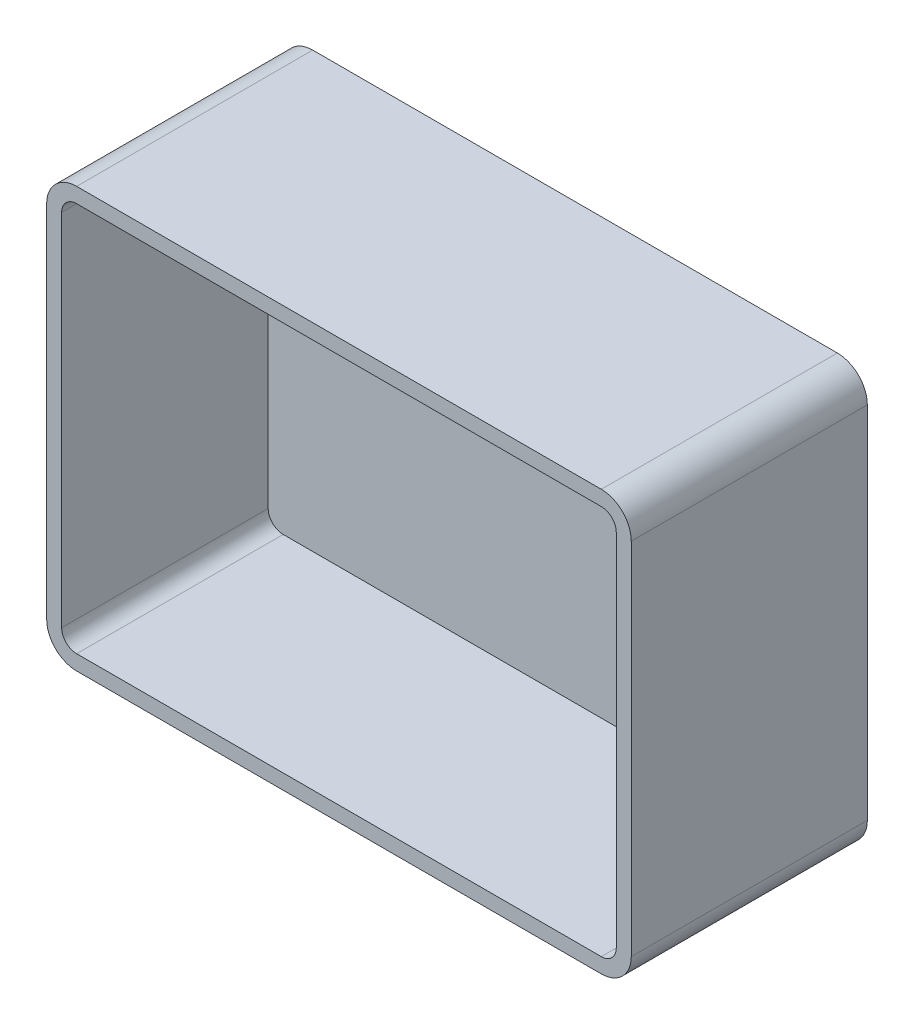
ISO-10303-21;
HEADER;
FILE_DESCRIPTION(('STEP AP214'),'2;1');
FILE_NAME('part.step','',(''),(''),'','','');
FILE_SCHEMA(('AUTOMOTIVE_DESIGN { 1 0 10303 214 1 1 1 1 }'));
ENDSEC;
DATA;
#1=APPLICATION_CONTEXT('core data for automotive mechanical design processes');
#2=APPLICATION_PROTOCOL_DEFINITION('international standard','automotive_design',2000,#1);
#3=PRODUCT_CONTEXT('',#1,'mechanical');
#4=PRODUCT('Part','Part','',(#3));
#5=PRODUCT_RELATED_PRODUCT_CATEGORY('part','',(#4));
#6=PRODUCT_DEFINITION_FORMATION('','',#4);
#7=PRODUCT_DEFINITION_CONTEXT('part definition',#1,'design');
#8=PRODUCT_DEFINITION('design','',#6,#7);
#9=PRODUCT_DEFINITION_SHAPE('','',#8);
#10=(LENGTH_UNIT() NAMED_UNIT(*) SI_UNIT(.MILLI.,.METRE.));
#11=(NAMED_UNIT(*) PLANE_ANGLE_UNIT() SI_UNIT($,.RADIAN.));
#12=(NAMED_UNIT(*) SI_UNIT($,.STERADIAN.) SOLID_ANGLE_UNIT());
#13=UNCERTAINTY_MEASURE_WITH_UNIT(LENGTH_MEASURE(1.E-05),#10,'distance_accuracy_value','');
#14=(GEOMETRIC_REPRESENTATION_CONTEXT(3) GLOBAL_UNCERTAINTY_ASSIGNED_CONTEXT((#13)) GLOBAL_UNIT_ASSIGNED_CONTEXT((#10,
#11,#12)) REPRESENTATION_CONTEXT('',''));
#15=CARTESIAN_POINT('',(0.,0.,0.));
#16=DIRECTION('',(0.,0.,1.));
#17=DIRECTION('',(1.,0.,0.));
#18=AXIS2_PLACEMENT_3D('',#15,#16,#17);
#19=CARTESIAN_POINT('',(-48.9405147058824,35.4503676470588,40.));
#20=DIRECTION('',(1.,0.,0.));
#21=DIRECTION('',(0.,1.,0.));
#22=AXIS2_PLACEMENT_3D('',#19,#20,#21);
#23=PLANE('',#22);
#24=DIRECTION('',(0.,-1.,0.));
#25=VECTOR('',#24,1.);
#26=CARTESIAN_POINT('',(-48.9405147058824,35.4503676470588,40.));
#27=LINE('',#26,#25);
#28=CARTESIAN_POINT('',(-48.9405147058824,30.3703676470588,40.));
#29=VERTEX_POINT('',#28);
#30=CARTESIAN_POINT('',(-48.9405147058824,-30.5896323529412,40.));
#31=VERTEX_POINT('',#30);
#32=EDGE_CURVE('E218',#29,#31,#27,.T.);
#33=ORIENTED_EDGE('',*,*,#32,.F.);
#34=DIRECTION('',(0.,0.,-1.));
#35=VECTOR('',#34,1.);
#36=CARTESIAN_POINT('',(-48.9405147058824,30.3703676470588,40.));
#37=LINE('',#36,#35);
#38=CARTESIAN_POINT('',(-48.9405147058824,30.3703676470588,0.));
#39=VERTEX_POINT('',#38);
#40=EDGE_CURVE('E267',#29,#39,#37,.T.);
#41=ORIENTED_EDGE('',*,*,#40,.T.);
#42=DIRECTION('',(0.,-1.,0.));
#43=VECTOR('',#42,1.);
#44=CARTESIAN_POINT('',(-48.9405147058824,35.4503676470588,0.));
#45=LINE('',#44,#43);
#46=CARTESIAN_POINT('',(-48.9405147058824,-30.5896323529412,0.));
#47=VERTEX_POINT('',#46);
#48=EDGE_CURVE('E206',#39,#47,#45,.T.);
#49=ORIENTED_EDGE('',*,*,#48,.T.);
#50=DIRECTION('',(0.,0.,-1.));
#51=VECTOR('',#50,1.);
#52=CARTESIAN_POINT('',(-48.9405147058824,-30.5896323529412,40.));
#53=LINE('',#52,#51);
#54=EDGE_CURVE('E265',#47,#31,#53,.F.);
#55=ORIENTED_EDGE('',*,*,#54,.T.);
#56=EDGE_LOOP('',(#33,#41,#49,#55));
#57=FACE_BOUND('',#56,.T.);
#58=ADVANCED_FACE('F33',(#57),#23,.F.);
#59=CARTESIAN_POINT('',(-48.9405147058824,-35.6696323529412,40.));
#60=DIRECTION('',(0.,1.,0.));
#61=DIRECTION('',(0.,0.,1.));
#62=AXIS2_PLACEMENT_3D('',#59,#60,#61);
#63=PLANE('',#62);
#64=DIRECTION('',(1.,0.,0.));
#65=VECTOR('',#64,1.);
#66=CARTESIAN_POINT('',(-48.9405147058824,-35.6696323529412,40.));
#67=LINE('',#66,#65);
#68=CARTESIAN_POINT('',(-43.8605147058824,-35.6696323529412,40.));
#69=VERTEX_POINT('',#68);
#70=CARTESIAN_POINT('',(45.0394852941176,-35.6696323529412,40.));
#71=VERTEX_POINT('',#70);
#72=EDGE_CURVE('E221',#69,#71,#67,.T.);
#73=ORIENTED_EDGE('',*,*,#72,.F.);
#74=DIRECTION('',(0.,0.,-1.));
#75=VECTOR('',#74,1.);
#76=CARTESIAN_POINT('',(-43.8605147058824,-35.6696323529412,40.));
#77=LINE('',#76,#75);
#78=CARTESIAN_POINT('',(-43.8605147058824,-35.6696323529412,0.));
#79=VERTEX_POINT('',#78);
#80=EDGE_CURVE('E11',#69,#79,#77,.T.);
#81=ORIENTED_EDGE('',*,*,#80,.T.);
#82=DIRECTION('',(1.,0.,0.));
#83=VECTOR('',#82,1.);
#84=CARTESIAN_POINT('',(-48.9405147058824,-35.6696323529412,0.));
#85=LINE('',#84,#83);
#86=CARTESIAN_POINT('',(45.0394852941176,-35.6696323529412,0.));
#87=VERTEX_POINT('',#86);
#88=EDGE_CURVE('E233',#79,#87,#85,.T.);
#89=ORIENTED_EDGE('',*,*,#88,.T.);
#90=DIRECTION('',(0.,0.,-1.));
#91=VECTOR('',#90,1.);
#92=CARTESIAN_POINT('',(45.0394852941176,-35.6696323529412,40.));
#93=LINE('',#92,#91);
#94=EDGE_CURVE('E41',#87,#71,#93,.F.);
#95=ORIENTED_EDGE('',*,*,#94,.T.);
#96=EDGE_LOOP('',(#73,#81,#89,#95));
#97=FACE_BOUND('',#96,.T.);
#98=ADVANCED_FACE('F284',(#97),#63,.F.);
#99=CARTESIAN_POINT('',(50.1194852941176,35.4503676470588,40.));
#100=DIRECTION('',(-1.,0.,0.));
#101=DIRECTION('',(0.,-1.,0.));
#102=AXIS2_PLACEMENT_3D('',#99,#100,#101);
#103=PLANE('',#102);
#104=DIRECTION('',(0.,1.,0.));
#105=VECTOR('',#104,1.);
#106=CARTESIAN_POINT('',(50.1194852941176,35.4503676470588,0.));
#107=LINE('',#106,#105);
#108=CARTESIAN_POINT('',(50.1194852941176,-30.5896323529412,0.));
#109=VERTEX_POINT('',#108);
#110=CARTESIAN_POINT('',(50.1194852941176,30.3703676470588,0.));
#111=VERTEX_POINT('',#110);
#112=EDGE_CURVE('E235',#109,#111,#107,.T.);
#113=ORIENTED_EDGE('',*,*,#112,.T.);
#114=DIRECTION('',(0.,0.,-1.));
#115=VECTOR('',#114,1.);
#116=CARTESIAN_POINT('',(50.1194852941176,30.3703676470588,40.));
#117=LINE('',#116,#115);
#118=CARTESIAN_POINT('',(50.1194852941176,30.3703676470588,40.));
#119=VERTEX_POINT('',#118);
#120=EDGE_CURVE('E255',#111,#119,#117,.F.);
#121=ORIENTED_EDGE('',*,*,#120,.T.);
#122=DIRECTION('',(0.,1.,0.));
#123=VECTOR('',#122,1.);
#124=CARTESIAN_POINT('',(50.1194852941176,35.4503676470588,40.));
#125=LINE('',#124,#123);
#126=CARTESIAN_POINT('',(50.1194852941176,-30.5896323529412,40.));
#127=VERTEX_POINT('',#126);
#128=EDGE_CURVE('E224',#127,#119,#125,.T.);
#129=ORIENTED_EDGE('',*,*,#128,.F.);
#130=DIRECTION('',(0.,0.,-1.));
#131=VECTOR('',#130,1.);
#132=CARTESIAN_POINT('',(50.1194852941176,-30.5896323529412,40.));
#133=LINE('',#132,#131);
#134=EDGE_CURVE('E252',#127,#109,#133,.T.);
#135=ORIENTED_EDGE('',*,*,#134,.T.);
#136=EDGE_LOOP('',(#113,#121,#129,#135));
#137=FACE_BOUND('',#136,.T.);
#138=ADVANCED_FACE('F293',(#137),#103,.F.);
#139=CARTESIAN_POINT('',(-48.9405147058824,35.4503676470588,40.));
#140=DIRECTION('',(0.,-1.,0.));
#141=DIRECTION('',(0.,0.,-1.));
#142=AXIS2_PLACEMENT_3D('',#139,#140,#141);
#143=PLANE('',#142);
#144=DIRECTION('',(-1.,0.,0.));
#145=VECTOR('',#144,1.);
#146=CARTESIAN_POINT('',(-48.9405147058824,35.4503676470588,40.));
#147=LINE('',#146,#145);
#148=CARTESIAN_POINT('',(45.0394852941176,35.4503676470588,40.));
#149=VERTEX_POINT('',#148);
#150=CARTESIAN_POINT('',(-43.8605147058824,35.4503676470588,40.));
#151=VERTEX_POINT('',#150);
#152=EDGE_CURVE('E227',#149,#151,#147,.T.);
#153=ORIENTED_EDGE('',*,*,#152,.F.);
#154=DIRECTION('',(0.,0.,-1.));
#155=VECTOR('',#154,1.);
#156=CARTESIAN_POINT('',(45.0394852941176,35.4503676470588,40.));
#157=LINE('',#156,#155);
#158=CARTESIAN_POINT('',(45.0394852941176,35.4503676470588,0.));
#159=VERTEX_POINT('',#158);
#160=EDGE_CURVE('E241',#149,#159,#157,.T.);
#161=ORIENTED_EDGE('',*,*,#160,.T.);
#162=DIRECTION('',(-1.,0.,0.));
#163=VECTOR('',#162,1.);
#164=CARTESIAN_POINT('',(-48.9405147058824,35.4503676470588,0.));
#165=LINE('',#164,#163);
#166=CARTESIAN_POINT('',(-43.8605147058824,35.4503676470588,0.));
#167=VERTEX_POINT('',#166);
#168=EDGE_CURVE('E222',#159,#167,#165,.T.);
#169=ORIENTED_EDGE('',*,*,#168,.T.);
#170=DIRECTION('',(0.,0.,-1.));
#171=VECTOR('',#170,1.);
#172=CARTESIAN_POINT('',(-43.8605147058824,35.4503676470588,40.));
#173=LINE('',#172,#171);
#174=EDGE_CURVE('E230',#167,#151,#173,.F.);
#175=ORIENTED_EDGE('',*,*,#174,.T.);
#176=EDGE_LOOP('',(#153,#161,#169,#175));
#177=FACE_BOUND('',#176,.T.);
#178=ADVANCED_FACE('F301',(#177),#143,.F.);
#179=CARTESIAN_POINT('',(0.,0.,40.));
#180=DIRECTION('',(0.,0.,1.));
#181=DIRECTION('',(1.,0.,0.));
#182=AXIS2_PLACEMENT_3D('',#179,#180,#181);
#183=PLANE('',#182);
#184=CARTESIAN_POINT('',(45.0394852941176,-30.5896323529412,40.));
#185=DIRECTION('',(0.,0.,1.));
#186=DIRECTION('',(1.,0.,0.));
#187=AXIS2_PLACEMENT_3D('',#184,#185,#186);
#188=CIRCLE('',#187,2.54);
#189=CARTESIAN_POINT('',(45.0394852941176,-33.1296323529412,40.));
#190=VERTEX_POINT('',#189);
#191=CARTESIAN_POINT('',(47.5794852941176,-30.5896323529412,40.));
#192=VERTEX_POINT('',#191);
#193=EDGE_CURVE('E48',#190,#192,#188,.T.);
#194=ORIENTED_EDGE('',*,*,#193,.F.);
#195=DIRECTION('',(1.,0.,0.));
#196=VECTOR('',#195,1.);
#197=CARTESIAN_POINT('',(-43.8605147058824,-33.1296323529412,40.));
#198=LINE('',#197,#196);
#199=CARTESIAN_POINT('',(-43.8605147058824,-33.1296323529412,40.));
#200=VERTEX_POINT('',#199);
#201=EDGE_CURVE('E168',#200,#190,#198,.T.);
#202=ORIENTED_EDGE('',*,*,#201,.F.);
#203=CARTESIAN_POINT('',(-43.8605147058824,-30.5896323529412,40.));
#204=DIRECTION('',(0.,0.,1.));
#205=DIRECTION('',(1.,0.,0.));
#206=AXIS2_PLACEMENT_3D('',#203,#204,#205);
#207=CIRCLE('',#206,2.54);
#208=CARTESIAN_POINT('',(-46.4005147058824,-30.5896323529412,40.));
#209=VERTEX_POINT('',#208);
#210=EDGE_CURVE('E171',#209,#200,#207,.T.);
#211=ORIENTED_EDGE('',*,*,#210,.F.);
#212=DIRECTION('',(0.,-1.,0.));
#213=VECTOR('',#212,1.);
#214=CARTESIAN_POINT('',(-46.4005147058824,30.3703676470588,40.));
#215=LINE('',#214,#213);
#216=CARTESIAN_POINT('',(-46.4005147058824,30.3703676470588,40.));
#217=VERTEX_POINT('',#216);
#218=EDGE_CURVE('E199',#217,#209,#215,.T.);
#219=ORIENTED_EDGE('',*,*,#218,.F.);
#220=CARTESIAN_POINT('',(-43.8605147058824,30.3703676470588,40.));
#221=DIRECTION('',(0.,0.,1.));
#222=DIRECTION('',(1.,0.,0.));
#223=AXIS2_PLACEMENT_3D('',#220,#221,#222);
#224=CIRCLE('',#223,2.54);
#225=CARTESIAN_POINT('',(-43.8605147058824,32.9103676470588,40.));
#226=VERTEX_POINT('',#225);
#227=EDGE_CURVE('E196',#226,#217,#224,.T.);
#228=ORIENTED_EDGE('',*,*,#227,.F.);
#229=DIRECTION('',(-1.,0.,0.));
#230=VECTOR('',#229,1.);
#231=CARTESIAN_POINT('',(45.0394852941176,32.9103676470588,40.));
#232=LINE('',#231,#230);
#233=CARTESIAN_POINT('',(45.0394852941176,32.9103676470588,40.));
#234=VERTEX_POINT('',#233);
#235=EDGE_CURVE('E193',#234,#226,#232,.T.);
#236=ORIENTED_EDGE('',*,*,#235,.F.);
#237=CARTESIAN_POINT('',(45.0394852941176,30.3703676470588,40.));
#238=DIRECTION('',(0.,0.,1.));
#239=DIRECTION('',(1.,0.,0.));
#240=AXIS2_PLACEMENT_3D('',#237,#238,#239);
#241=CIRCLE('',#240,2.54);
#242=CARTESIAN_POINT('',(47.5794852941176,30.3703676470588,40.));
#243=VERTEX_POINT('',#242);
#244=EDGE_CURVE('E190',#243,#234,#241,.T.);
#245=ORIENTED_EDGE('',*,*,#244,.F.);
#246=DIRECTION('',(0.,1.,0.));
#247=VECTOR('',#246,1.);
#248=CARTESIAN_POINT('',(47.5794852941176,-30.5896323529412,40.));
#249=LINE('',#248,#247);
#250=EDGE_CURVE('E188',#192,#243,#249,.T.);
#251=ORIENTED_EDGE('',*,*,#250,.F.);
#252=EDGE_LOOP('',(#194,#202,#211,#219,#228,#236,#245,#251));
#253=FACE_BOUND('',#252,.T.);
#254=ORIENTED_EDGE('',*,*,#128,.T.);
#255=CARTESIAN_POINT('',(45.0394852941176,30.3703676470588,40.));
#256=DIRECTION('',(0.,0.,1.));
#257=DIRECTION('',(1.,0.,0.));
#258=AXIS2_PLACEMENT_3D('',#255,#256,#257);
#259=CIRCLE('',#258,5.08);
#260=EDGE_CURVE('E263',#119,#149,#259,.T.);
#261=ORIENTED_EDGE('',*,*,#260,.T.);
#262=ORIENTED_EDGE('',*,*,#152,.T.);
#263=CARTESIAN_POINT('',(-43.8605147058824,30.3703676470588,40.));
#264=DIRECTION('',(0.,0.,1.));
#265=DIRECTION('',(1.,0.,0.));
#266=AXIS2_PLACEMENT_3D('',#263,#264,#265);
#267=CIRCLE('',#266,5.08);
#268=EDGE_CURVE('E261',#151,#29,#267,.T.);
#269=ORIENTED_EDGE('',*,*,#268,.T.);
#270=ORIENTED_EDGE('',*,*,#32,.T.);
#271=CARTESIAN_POINT('',(-43.8605147058824,-30.5896323529412,40.));
#272=DIRECTION('',(0.,0.,1.));
#273=DIRECTION('',(1.,0.,0.));
#274=AXIS2_PLACEMENT_3D('',#271,#272,#273);
#275=CIRCLE('',#274,5.08);
#276=EDGE_CURVE('E259',#31,#69,#275,.T.);
#277=ORIENTED_EDGE('',*,*,#276,.T.);
#278=ORIENTED_EDGE('',*,*,#72,.T.);
#279=CARTESIAN_POINT('',(45.0394852941176,-30.5896323529412,40.));
#280=DIRECTION('',(0.,0.,1.));
#281=DIRECTION('',(1.,0.,0.));
#282=AXIS2_PLACEMENT_3D('',#279,#280,#281);
#283=CIRCLE('',#282,5.08);
#284=EDGE_CURVE('E257',#71,#127,#283,.T.);
#285=ORIENTED_EDGE('',*,*,#284,.T.);
#286=EDGE_LOOP('',(#254,#261,#262,#269,#270,#277,#278,#285));
#287=FACE_BOUND('',#286,.T.);
#288=ADVANCED_FACE('F287',(#253,#287),#183,.T.);
#289=CARTESIAN_POINT('',(0.,0.,0.));
#290=DIRECTION('',(0.,0.,1.));
#291=DIRECTION('',(1.,0.,0.));
#292=AXIS2_PLACEMENT_3D('',#289,#290,#291);
#293=PLANE('',#292);
#294=ORIENTED_EDGE('',*,*,#168,.F.);
#295=CARTESIAN_POINT('',(45.0394852941176,30.3703676470588,0.));
#296=DIRECTION('',(0.,0.,1.));
#297=DIRECTION('',(1.,0.,0.));
#298=AXIS2_PLACEMENT_3D('',#295,#296,#297);
#299=CIRCLE('',#298,5.08);
#300=EDGE_CURVE('E250',#159,#111,#299,.F.);
#301=ORIENTED_EDGE('',*,*,#300,.T.);
#302=ORIENTED_EDGE('',*,*,#112,.F.);
#303=CARTESIAN_POINT('',(45.0394852941176,-30.5896323529412,0.));
#304=DIRECTION('',(0.,0.,1.));
#305=DIRECTION('',(1.,0.,0.));
#306=AXIS2_PLACEMENT_3D('',#303,#304,#305);
#307=CIRCLE('',#306,5.08);
#308=EDGE_CURVE('E244',#109,#87,#307,.F.);
#309=ORIENTED_EDGE('',*,*,#308,.T.);
#310=ORIENTED_EDGE('',*,*,#88,.F.);
#311=CARTESIAN_POINT('',(-43.8605147058824,-30.5896323529412,0.));
#312=DIRECTION('',(0.,0.,1.));
#313=DIRECTION('',(1.,0.,0.));
#314=AXIS2_PLACEMENT_3D('',#311,#312,#313);
#315=CIRCLE('',#314,5.08);
#316=EDGE_CURVE('E246',#79,#47,#315,.F.);
#317=ORIENTED_EDGE('',*,*,#316,.T.);
#318=ORIENTED_EDGE('',*,*,#48,.F.);
#319=CARTESIAN_POINT('',(-43.8605147058824,30.3703676470588,0.));
#320=DIRECTION('',(0.,0.,1.));
#321=DIRECTION('',(1.,0.,0.));
#322=AXIS2_PLACEMENT_3D('',#319,#320,#321);
#323=CIRCLE('',#322,5.08);
#324=EDGE_CURVE('E248',#39,#167,#323,.F.);
#325=ORIENTED_EDGE('',*,*,#324,.T.);
#326=EDGE_LOOP('',(#294,#301,#302,#309,#310,#317,#318,#325));
#327=FACE_BOUND('',#326,.T.);
#328=ADVANCED_FACE('F278',(#327),#293,.F.);
#329=CARTESIAN_POINT('',(45.0394852941176,30.3703676470588,40.));
#330=DIRECTION('',(0.,0.,-1.));
#331=DIRECTION('',(-1.,0.,0.));
#332=AXIS2_PLACEMENT_3D('',#329,#330,#331);
#333=CYLINDRICAL_SURFACE('',#332,5.08);
#334=ORIENTED_EDGE('',*,*,#260,.F.);
#335=ORIENTED_EDGE('',*,*,#120,.F.);
#336=ORIENTED_EDGE('',*,*,#300,.F.);
#337=ORIENTED_EDGE('',*,*,#160,.F.);
#338=EDGE_LOOP('',(#334,#335,#336,#337));
#339=FACE_BOUND('',#338,.T.);
#340=ADVANCED_FACE('F298',(#339),#333,.T.);
#341=CARTESIAN_POINT('',(-43.8605147058824,30.3703676470588,40.));
#342=DIRECTION('',(0.,0.,-1.));
#343=DIRECTION('',(-1.,0.,0.));
#344=AXIS2_PLACEMENT_3D('',#341,#342,#343);
#345=CYLINDRICAL_SURFACE('',#344,5.08);
#346=ORIENTED_EDGE('',*,*,#268,.F.);
#347=ORIENTED_EDGE('',*,*,#174,.F.);
#348=ORIENTED_EDGE('',*,*,#324,.F.);
#349=ORIENTED_EDGE('',*,*,#40,.F.);
#350=EDGE_LOOP('',(#346,#347,#348,#349));
#351=FACE_BOUND('',#350,.T.);
#352=ADVANCED_FACE('F303',(#351),#345,.T.);
#353=CARTESIAN_POINT('',(-43.8605147058824,-30.5896323529412,40.));
#354=DIRECTION('',(0.,0.,-1.));
#355=DIRECTION('',(-1.,0.,0.));
#356=AXIS2_PLACEMENT_3D('',#353,#354,#355);
#357=CYLINDRICAL_SURFACE('',#356,5.08);
#358=ORIENTED_EDGE('',*,*,#276,.F.);
#359=ORIENTED_EDGE('',*,*,#54,.F.);
#360=ORIENTED_EDGE('',*,*,#316,.F.);
#361=ORIENTED_EDGE('',*,*,#80,.F.);
#362=EDGE_LOOP('',(#358,#359,#360,#361));
#363=FACE_BOUND('',#362,.T.);
#364=ADVANCED_FACE('F283',(#363),#357,.T.);
#365=CARTESIAN_POINT('',(45.0394852941176,-30.5896323529412,40.));
#366=DIRECTION('',(0.,0.,-1.));
#367=DIRECTION('',(-1.,0.,0.));
#368=AXIS2_PLACEMENT_3D('',#365,#366,#367);
#369=CYLINDRICAL_SURFACE('',#368,5.08);
#370=ORIENTED_EDGE('',*,*,#284,.F.);
#371=ORIENTED_EDGE('',*,*,#94,.F.);
#372=ORIENTED_EDGE('',*,*,#308,.F.);
#373=ORIENTED_EDGE('',*,*,#134,.F.);
#374=EDGE_LOOP('',(#370,#371,#372,#373));
#375=FACE_BOUND('',#374,.T.);
#376=ADVANCED_FACE('F35',(#375),#369,.T.);
#377=CARTESIAN_POINT('',(45.0394852941176,-30.5896323529412,5.));
#378=DIRECTION('',(0.,0.,1.));
#379=DIRECTION('',(1.,0.,0.));
#380=AXIS2_PLACEMENT_3D('',#377,#378,#379);
#381=CYLINDRICAL_SURFACE('',#380,2.54);
#382=ORIENTED_EDGE('',*,*,#193,.T.);
#383=DIRECTION('',(0.,0.,1.));
#384=VECTOR('',#383,1.);
#385=CARTESIAN_POINT('',(47.5794852941176,-30.5896323529412,5.));
#386=LINE('',#385,#384);
#387=CARTESIAN_POINT('',(47.5794852941176,-30.5896323529412,5.));
#388=VERTEX_POINT('',#387);
#389=EDGE_CURVE('E145',#388,#192,#386,.T.);
#390=ORIENTED_EDGE('',*,*,#389,.F.);
#391=CARTESIAN_POINT('',(45.0394852941176,-30.5896323529412,5.));
#392=DIRECTION('',(0.,0.,1.));
#393=DIRECTION('',(1.,0.,0.));
#394=AXIS2_PLACEMENT_3D('',#391,#392,#393);
#395=CIRCLE('',#394,2.54);
#396=CARTESIAN_POINT('',(45.0394852941176,-33.1296323529412,5.));
#397=VERTEX_POINT('',#396);
#398=EDGE_CURVE('E149',#397,#388,#395,.T.);
#399=ORIENTED_EDGE('',*,*,#398,.F.);
#400=DIRECTION('',(0.,0.,1.));
#401=VECTOR('',#400,1.);
#402=CARTESIAN_POINT('',(45.0394852941176,-33.1296323529412,5.));
#403=LINE('',#402,#401);
#404=EDGE_CURVE('E204',#397,#190,#403,.T.);
#405=ORIENTED_EDGE('',*,*,#404,.T.);
#406=EDGE_LOOP('',(#382,#390,#399,#405));
#407=FACE_BOUND('',#406,.T.);
#408=ADVANCED_FACE('F147',(#407),#381,.F.);
#409=CARTESIAN_POINT('',(-43.8605147058824,-33.1296323529412,5.));
#410=DIRECTION('',(0.,-1.,0.));
#411=DIRECTION('',(0.,0.,-1.));
#412=AXIS2_PLACEMENT_3D('',#409,#410,#411);
#413=PLANE('',#412);
#414=ORIENTED_EDGE('',*,*,#201,.T.);
#415=ORIENTED_EDGE('',*,*,#404,.F.);
#416=DIRECTION('',(1.,0.,0.));
#417=VECTOR('',#416,1.);
#418=CARTESIAN_POINT('',(-43.8605147058824,-33.1296323529412,5.));
#419=LINE('',#418,#417);
#420=CARTESIAN_POINT('',(-43.8605147058824,-33.1296323529412,5.));
#421=VERTEX_POINT('',#420);
#422=EDGE_CURVE('E155',#421,#397,#419,.T.);
#423=ORIENTED_EDGE('',*,*,#422,.F.);
#424=DIRECTION('',(0.,0.,1.));
#425=VECTOR('',#424,1.);
#426=CARTESIAN_POINT('',(-43.8605147058824,-33.1296323529412,5.));
#427=LINE('',#426,#425);
#428=EDGE_CURVE('E207',#421,#200,#427,.T.);
#429=ORIENTED_EDGE('',*,*,#428,.T.);
#430=EDGE_LOOP('',(#414,#415,#423,#429));
#431=FACE_BOUND('',#430,.T.);
#432=ADVANCED_FACE('F329',(#431),#413,.F.);
#433=CARTESIAN_POINT('',(-43.8605147058824,-30.5896323529412,5.));
#434=DIRECTION('',(0.,0.,1.));
#435=DIRECTION('',(1.,0.,0.));
#436=AXIS2_PLACEMENT_3D('',#433,#434,#435);
#437=CYLINDRICAL_SURFACE('',#436,2.54);
#438=ORIENTED_EDGE('',*,*,#210,.T.);
#439=ORIENTED_EDGE('',*,*,#428,.F.);
#440=CARTESIAN_POINT('',(-43.8605147058824,-30.5896323529412,5.));
#441=DIRECTION('',(0.,0.,1.));
#442=DIRECTION('',(1.,0.,0.));
#443=AXIS2_PLACEMENT_3D('',#440,#441,#442);
#444=CIRCLE('',#443,2.54);
#445=CARTESIAN_POINT('',(-46.4005147058824,-30.5896323529412,5.));
#446=VERTEX_POINT('',#445);
#447=EDGE_CURVE('E184',#446,#421,#444,.T.);
#448=ORIENTED_EDGE('',*,*,#447,.F.);
#449=DIRECTION('',(0.,0.,1.));
#450=VECTOR('',#449,1.);
#451=CARTESIAN_POINT('',(-46.4005147058824,-30.5896323529412,5.));
#452=LINE('',#451,#450);
#453=EDGE_CURVE('E209',#446,#209,#452,.T.);
#454=ORIENTED_EDGE('',*,*,#453,.T.);
#455=EDGE_LOOP('',(#438,#439,#448,#454));
#456=FACE_BOUND('',#455,.T.);
#457=ADVANCED_FACE('F347',(#456),#437,.F.);
#458=CARTESIAN_POINT('',(-46.4005147058824,30.3703676470588,5.));
#459=DIRECTION('',(-1.,0.,0.));
#460=DIRECTION('',(0.,-1.,0.));
#461=AXIS2_PLACEMENT_3D('',#458,#459,#460);
#462=PLANE('',#461);
#463=ORIENTED_EDGE('',*,*,#218,.T.);
#464=ORIENTED_EDGE('',*,*,#453,.F.);
#465=DIRECTION('',(0.,-1.,0.));
#466=VECTOR('',#465,1.);
#467=CARTESIAN_POINT('',(-46.4005147058824,30.3703676470588,5.));
#468=LINE('',#467,#466);
#469=CARTESIAN_POINT('',(-46.4005147058824,30.3703676470588,5.));
#470=VERTEX_POINT('',#469);
#471=EDGE_CURVE('E181',#470,#446,#468,.T.);
#472=ORIENTED_EDGE('',*,*,#471,.F.);
#473=DIRECTION('',(0.,0.,1.));
#474=VECTOR('',#473,1.);
#475=CARTESIAN_POINT('',(-46.4005147058824,30.3703676470588,5.));
#476=LINE('',#475,#474);
#477=EDGE_CURVE('E211',#470,#217,#476,.T.);
#478=ORIENTED_EDGE('',*,*,#477,.T.);
#479=EDGE_LOOP('',(#463,#464,#472,#478));
#480=FACE_BOUND('',#479,.T.);
#481=ADVANCED_FACE('F343',(#480),#462,.F.);
#482=CARTESIAN_POINT('',(-43.8605147058824,30.3703676470588,5.));
#483=DIRECTION('',(0.,0.,1.));
#484=DIRECTION('',(1.,0.,0.));
#485=AXIS2_PLACEMENT_3D('',#482,#483,#484);
#486=CYLINDRICAL_SURFACE('',#485,2.54);
#487=ORIENTED_EDGE('',*,*,#227,.T.);
#488=ORIENTED_EDGE('',*,*,#477,.F.);
#489=CARTESIAN_POINT('',(-43.8605147058824,30.3703676470588,5.));
#490=DIRECTION('',(0.,0.,1.));
#491=DIRECTION('',(1.,0.,0.));
#492=AXIS2_PLACEMENT_3D('',#489,#490,#491);
#493=CIRCLE('',#492,2.54);
#494=CARTESIAN_POINT('',(-43.8605147058824,32.9103676470588,5.));
#495=VERTEX_POINT('',#494);
#496=EDGE_CURVE('E178',#495,#470,#493,.T.);
#497=ORIENTED_EDGE('',*,*,#496,.F.);
#498=DIRECTION('',(0.,0.,1.));
#499=VECTOR('',#498,1.);
#500=CARTESIAN_POINT('',(-43.8605147058824,32.9103676470588,5.));
#501=LINE('',#500,#499);
#502=EDGE_CURVE('E213',#495,#226,#501,.T.);
#503=ORIENTED_EDGE('',*,*,#502,.T.);
#504=EDGE_LOOP('',(#487,#488,#497,#503));
#505=FACE_BOUND('',#504,.T.);
#506=ADVANCED_FACE('F339',(#505),#486,.F.);
#507=CARTESIAN_POINT('',(45.0394852941176,32.9103676470588,5.));
#508=DIRECTION('',(0.,1.,0.));
#509=DIRECTION('',(0.,0.,1.));
#510=AXIS2_PLACEMENT_3D('',#507,#508,#509);
#511=PLANE('',#510);
#512=ORIENTED_EDGE('',*,*,#235,.T.);
#513=ORIENTED_EDGE('',*,*,#502,.F.);
#514=DIRECTION('',(-1.,0.,0.));
#515=VECTOR('',#514,1.);
#516=CARTESIAN_POINT('',(45.0394852941176,32.9103676470588,5.));
#517=LINE('',#516,#515);
#518=CARTESIAN_POINT('',(45.0394852941176,32.9103676470588,5.));
#519=VERTEX_POINT('',#518);
#520=EDGE_CURVE('E175',#519,#495,#517,.T.);
#521=ORIENTED_EDGE('',*,*,#520,.F.);
#522=DIRECTION('',(0.,0.,1.));
#523=VECTOR('',#522,1.);
#524=CARTESIAN_POINT('',(45.0394852941176,32.9103676470588,5.));
#525=LINE('',#524,#523);
#526=EDGE_CURVE('E215',#519,#234,#525,.T.);
#527=ORIENTED_EDGE('',*,*,#526,.T.);
#528=EDGE_LOOP('',(#512,#513,#521,#527));
#529=FACE_BOUND('',#528,.T.);
#530=ADVANCED_FACE('F335',(#529),#511,.F.);
#531=CARTESIAN_POINT('',(45.0394852941176,30.3703676470588,5.));
#532=DIRECTION('',(0.,0.,1.));
#533=DIRECTION('',(1.,0.,0.));
#534=AXIS2_PLACEMENT_3D('',#531,#532,#533);
#535=CYLINDRICAL_SURFACE('',#534,2.54);
#536=ORIENTED_EDGE('',*,*,#244,.T.);
#537=ORIENTED_EDGE('',*,*,#526,.F.);
#538=CARTESIAN_POINT('',(45.0394852941176,30.3703676470588,5.));
#539=DIRECTION('',(0.,0.,1.));
#540=DIRECTION('',(1.,0.,0.));
#541=AXIS2_PLACEMENT_3D('',#538,#539,#540);
#542=CIRCLE('',#541,2.54);
#543=CARTESIAN_POINT('',(47.5794852941176,30.3703676470588,5.));
#544=VERTEX_POINT('',#543);
#545=EDGE_CURVE('E163',#544,#519,#542,.T.);
#546=ORIENTED_EDGE('',*,*,#545,.F.);
#547=DIRECTION('',(0.,0.,1.));
#548=VECTOR('',#547,1.);
#549=CARTESIAN_POINT('',(47.5794852941176,30.3703676470588,5.));
#550=LINE('',#549,#548);
#551=EDGE_CURVE('E154',#544,#243,#550,.T.);
#552=ORIENTED_EDGE('',*,*,#551,.T.);
#553=EDGE_LOOP('',(#536,#537,#546,#552));
#554=FACE_BOUND('',#553,.T.);
#555=ADVANCED_FACE('F332',(#554),#535,.F.);
#556=CARTESIAN_POINT('',(47.5794852941176,-30.5896323529412,5.));
#557=DIRECTION('',(1.,0.,0.));
#558=DIRECTION('',(0.,1.,0.));
#559=AXIS2_PLACEMENT_3D('',#556,#557,#558);
#560=PLANE('',#559);
#561=ORIENTED_EDGE('',*,*,#250,.T.);
#562=ORIENTED_EDGE('',*,*,#551,.F.);
#563=DIRECTION('',(0.,1.,0.));
#564=VECTOR('',#563,1.);
#565=CARTESIAN_POINT('',(47.5794852941176,-30.5896323529412,5.));
#566=LINE('',#565,#564);
#567=EDGE_CURVE('E158',#388,#544,#566,.T.);
#568=ORIENTED_EDGE('',*,*,#567,.F.);
#569=ORIENTED_EDGE('',*,*,#389,.T.);
#570=EDGE_LOOP('',(#561,#562,#568,#569));
#571=FACE_BOUND('',#570,.T.);
#572=ADVANCED_FACE('F159',(#571),#560,.F.);
#573=CARTESIAN_POINT('',(45.0394852941176,-30.5896323529412,5.));
#574=DIRECTION('',(0.,0.,1.));
#575=DIRECTION('',(1.,0.,0.));
#576=AXIS2_PLACEMENT_3D('',#573,#574,#575);
#577=PLANE('',#576);
#578=ORIENTED_EDGE('',*,*,#398,.T.);
#579=ORIENTED_EDGE('',*,*,#567,.T.);
#580=ORIENTED_EDGE('',*,*,#545,.T.);
#581=ORIENTED_EDGE('',*,*,#520,.T.);
#582=ORIENTED_EDGE('',*,*,#496,.T.);
#583=ORIENTED_EDGE('',*,*,#471,.T.);
#584=ORIENTED_EDGE('',*,*,#447,.T.);
#585=ORIENTED_EDGE('',*,*,#422,.T.);
#586=EDGE_LOOP('',(#578,#579,#580,#581,#582,#583,#584,#585));
#587=FACE_BOUND('',#586,.T.);
#588=ADVANCED_FACE('F165',(#587),#577,.T.);
#589=CLOSED_SHELL('',(#58,#98,#138,#178,#288,#328,#340,#352,#364,#376,#408,#432,#457,#481,#506,
#530,#555,#572,#588));
#590=MANIFOLD_SOLID_BREP('B2',#589);
#591=ADVANCED_BREP_SHAPE_REPRESENTATION('',(#18,#590),#14);
#592=SHAPE_DEFINITION_REPRESENTATION(#9,#591);
ENDSEC;
END-ISO-10303-21;
